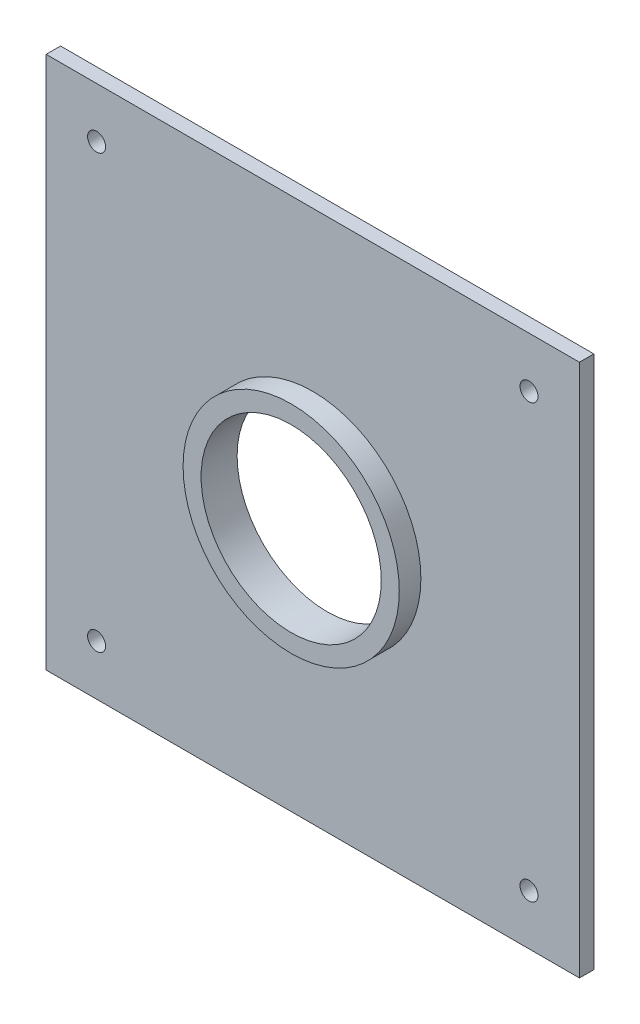
ISO-10303-21;
HEADER;
FILE_DESCRIPTION(('STEP AP214'),'2;1');
FILE_NAME('part.step','',(''),(''),'','','');
FILE_SCHEMA(('AUTOMOTIVE_DESIGN { 1 0 10303 214 1 1 1 1 }'));
ENDSEC;
DATA;
#1=APPLICATION_CONTEXT('core data for automotive mechanical design processes');
#2=APPLICATION_PROTOCOL_DEFINITION('international standard','automotive_design',2000,#1);
#3=PRODUCT_CONTEXT('',#1,'mechanical');
#4=PRODUCT('Part','Part','',(#3));
#5=PRODUCT_RELATED_PRODUCT_CATEGORY('part','',(#4));
#6=PRODUCT_DEFINITION_FORMATION('','',#4);
#7=PRODUCT_DEFINITION_CONTEXT('part definition',#1,'design');
#8=PRODUCT_DEFINITION('design','',#6,#7);
#9=PRODUCT_DEFINITION_SHAPE('','',#8);
#10=(LENGTH_UNIT() NAMED_UNIT(*) SI_UNIT(.MILLI.,.METRE.));
#11=(NAMED_UNIT(*) PLANE_ANGLE_UNIT() SI_UNIT($,.RADIAN.));
#12=(NAMED_UNIT(*) SI_UNIT($,.STERADIAN.) SOLID_ANGLE_UNIT());
#13=UNCERTAINTY_MEASURE_WITH_UNIT(LENGTH_MEASURE(1.E-05),#10,'distance_accuracy_value','');
#14=(GEOMETRIC_REPRESENTATION_CONTEXT(3) GLOBAL_UNCERTAINTY_ASSIGNED_CONTEXT((#13)) GLOBAL_UNIT_ASSIGNED_CONTEXT((#10,
#11,#12)) REPRESENTATION_CONTEXT('',''));
#15=CARTESIAN_POINT('',(0.,0.,0.));
#16=DIRECTION('',(0.,0.,1.));
#17=DIRECTION('',(1.,0.,0.));
#18=AXIS2_PLACEMENT_3D('',#15,#16,#17);
#19=CARTESIAN_POINT('',(0.,0.,0.));
#20=DIRECTION('',(0.,0.,-1.));
#21=DIRECTION('',(-1.,0.,0.));
#22=AXIS2_PLACEMENT_3D('',#19,#20,#21);
#23=PLANE('',#22);
#24=DIRECTION('',(0.,1.,0.));
#25=VECTOR('',#24,1.);
#26=CARTESIAN_POINT('',(0.,0.,0.));
#27=LINE('',#26,#25);
#28=CARTESIAN_POINT('',(0.,-74.,0.));
#29=VERTEX_POINT('',#28);
#30=CARTESIAN_POINT('',(0.,0.,0.));
#31=VERTEX_POINT('',#30);
#32=EDGE_CURVE('E101',#29,#31,#27,.T.);
#33=ORIENTED_EDGE('',*,*,#32,.F.);
#34=DIRECTION('',(1.,0.,0.));
#35=VECTOR('',#34,1.);
#36=CARTESIAN_POINT('',(0.,-74.,0.));
#37=LINE('',#36,#35);
#38=CARTESIAN_POINT('',(-74.,-74.,0.));
#39=VERTEX_POINT('',#38);
#40=EDGE_CURVE('E74',#39,#29,#37,.T.);
#41=ORIENTED_EDGE('',*,*,#40,.F.);
#42=DIRECTION('',(0.,-1.,0.));
#43=VECTOR('',#42,1.);
#44=CARTESIAN_POINT('',(-74.,0.,0.));
#45=LINE('',#44,#43);
#46=CARTESIAN_POINT('',(-74.,0.,0.));
#47=VERTEX_POINT('',#46);
#48=EDGE_CURVE('E68',#47,#39,#45,.T.);
#49=ORIENTED_EDGE('',*,*,#48,.F.);
#50=DIRECTION('',(-1.,0.,0.));
#51=VECTOR('',#50,1.);
#52=CARTESIAN_POINT('',(0.,0.,0.));
#53=LINE('',#52,#51);
#54=EDGE_CURVE('E92',#31,#47,#53,.T.);
#55=ORIENTED_EDGE('',*,*,#54,.F.);
#56=EDGE_LOOP('',(#33,#41,#49,#55));
#57=FACE_BOUND('',#56,.T.);
#58=CARTESIAN_POINT('',(-37.,-37.,0.));
#59=DIRECTION('',(0.,0.,-1.));
#60=DIRECTION('',(-1.,0.,0.));
#61=AXIS2_PLACEMENT_3D('',#58,#59,#60);
#62=CIRCLE('',#61,12.5);
#63=CARTESIAN_POINT('',(-49.5,-37.,0.));
#64=VERTEX_POINT('',#63);
#65=EDGE_CURVE('E118',#64,#64,#62,.T.);
#66=ORIENTED_EDGE('',*,*,#65,.F.);
#67=EDGE_LOOP('',(#66));
#68=FACE_BOUND('',#67,.T.);
#69=CARTESIAN_POINT('',(-7.00000000000001,-67.,0.));
#70=DIRECTION('',(0.,0.,1.));
#71=DIRECTION('',(1.,0.,0.));
#72=AXIS2_PLACEMENT_3D('',#69,#70,#71);
#73=CIRCLE('',#72,1.24999999999999);
#74=CARTESIAN_POINT('',(-5.75000000000002,-67.,0.));
#75=VERTEX_POINT('',#74);
#76=EDGE_CURVE('E122',#75,#75,#73,.T.);
#77=ORIENTED_EDGE('',*,*,#76,.T.);
#78=EDGE_LOOP('',(#77));
#79=FACE_BOUND('',#78,.T.);
#80=CARTESIAN_POINT('',(-67.,-67.,0.));
#81=DIRECTION('',(0.,0.,1.));
#82=DIRECTION('',(1.,0.,0.));
#83=AXIS2_PLACEMENT_3D('',#80,#81,#82);
#84=CIRCLE('',#83,1.24999999999999);
#85=CARTESIAN_POINT('',(-65.75,-67.,0.));
#86=VERTEX_POINT('',#85);
#87=EDGE_CURVE('E126',#86,#86,#84,.T.);
#88=ORIENTED_EDGE('',*,*,#87,.T.);
#89=EDGE_LOOP('',(#88));
#90=FACE_BOUND('',#89,.T.);
#91=CARTESIAN_POINT('',(-7.00000000000001,-7.00000000000003,0.));
#92=DIRECTION('',(0.,0.,1.));
#93=DIRECTION('',(1.,0.,0.));
#94=AXIS2_PLACEMENT_3D('',#91,#92,#93);
#95=CIRCLE('',#94,1.24999999999999);
#96=CARTESIAN_POINT('',(-5.75000000000002,-7.00000000000003,0.));
#97=VERTEX_POINT('',#96);
#98=EDGE_CURVE('E130',#97,#97,#95,.T.);
#99=ORIENTED_EDGE('',*,*,#98,.T.);
#100=EDGE_LOOP('',(#99));
#101=FACE_BOUND('',#100,.T.);
#102=CARTESIAN_POINT('',(-67.,-7.00000000000002,0.));
#103=DIRECTION('',(0.,0.,1.));
#104=DIRECTION('',(1.,0.,0.));
#105=AXIS2_PLACEMENT_3D('',#102,#103,#104);
#106=CIRCLE('',#105,1.24999999999999);
#107=CARTESIAN_POINT('',(-65.75,-7.00000000000002,0.));
#108=VERTEX_POINT('',#107);
#109=EDGE_CURVE('E133',#108,#108,#106,.T.);
#110=ORIENTED_EDGE('',*,*,#109,.T.);
#111=EDGE_LOOP('',(#110));
#112=FACE_BOUND('',#111,.T.);
#113=ADVANCED_FACE('F34',(#57,#68,#79,#90,#101,#112),#23,.T.);
#114=CARTESIAN_POINT('',(0.,0.,2.));
#115=DIRECTION('',(-1.,0.,0.));
#116=DIRECTION('',(0.,0.,1.));
#117=AXIS2_PLACEMENT_3D('',#114,#115,#116);
#118=PLANE('',#117);
#119=ORIENTED_EDGE('',*,*,#32,.T.);
#120=DIRECTION('',(0.,0.,-1.));
#121=VECTOR('',#120,1.);
#122=CARTESIAN_POINT('',(0.,0.,2.));
#123=LINE('',#122,#121);
#124=CARTESIAN_POINT('',(0.,0.,2.));
#125=VERTEX_POINT('',#124);
#126=EDGE_CURVE('E43',#125,#31,#123,.T.);
#127=ORIENTED_EDGE('',*,*,#126,.F.);
#128=DIRECTION('',(0.,1.,0.));
#129=VECTOR('',#128,1.);
#130=CARTESIAN_POINT('',(0.,0.,2.));
#131=LINE('',#130,#129);
#132=CARTESIAN_POINT('',(0.,-74.,2.));
#133=VERTEX_POINT('',#132);
#134=EDGE_CURVE('E87',#133,#125,#131,.T.);
#135=ORIENTED_EDGE('',*,*,#134,.F.);
#136=DIRECTION('',(0.,0.,-1.));
#137=VECTOR('',#136,1.);
#138=CARTESIAN_POINT('',(0.,-74.,2.));
#139=LINE('',#138,#137);
#140=EDGE_CURVE('E97',#133,#29,#139,.T.);
#141=ORIENTED_EDGE('',*,*,#140,.T.);
#142=EDGE_LOOP('',(#119,#127,#135,#141));
#143=FACE_BOUND('',#142,.T.);
#144=ADVANCED_FACE('F36',(#143),#118,.F.);
#145=CARTESIAN_POINT('',(0.,0.,2.));
#146=DIRECTION('',(0.,-1.,0.));
#147=DIRECTION('',(1.,0.,0.));
#148=AXIS2_PLACEMENT_3D('',#145,#146,#147);
#149=PLANE('',#148);
#150=ORIENTED_EDGE('',*,*,#54,.T.);
#151=DIRECTION('',(0.,0.,-1.));
#152=VECTOR('',#151,1.);
#153=CARTESIAN_POINT('',(-74.,0.,2.));
#154=LINE('',#153,#152);
#155=CARTESIAN_POINT('',(-74.,0.,2.));
#156=VERTEX_POINT('',#155);
#157=EDGE_CURVE('E90',#156,#47,#154,.T.);
#158=ORIENTED_EDGE('',*,*,#157,.F.);
#159=DIRECTION('',(-1.,0.,0.));
#160=VECTOR('',#159,1.);
#161=CARTESIAN_POINT('',(0.,0.,2.));
#162=LINE('',#161,#160);
#163=EDGE_CURVE('E82',#125,#156,#162,.T.);
#164=ORIENTED_EDGE('',*,*,#163,.F.);
#165=ORIENTED_EDGE('',*,*,#126,.T.);
#166=EDGE_LOOP('',(#150,#158,#164,#165));
#167=FACE_BOUND('',#166,.T.);
#168=ADVANCED_FACE('F91',(#167),#149,.F.);
#169=CARTESIAN_POINT('',(-74.,0.,2.));
#170=DIRECTION('',(1.,0.,0.));
#171=DIRECTION('',(0.,0.,-1.));
#172=AXIS2_PLACEMENT_3D('',#169,#170,#171);
#173=PLANE('',#172);
#174=ORIENTED_EDGE('',*,*,#48,.T.);
#175=DIRECTION('',(0.,0.,-1.));
#176=VECTOR('',#175,1.);
#177=CARTESIAN_POINT('',(-74.,-74.,2.));
#178=LINE('',#177,#176);
#179=CARTESIAN_POINT('',(-74.,-74.,2.));
#180=VERTEX_POINT('',#179);
#181=EDGE_CURVE('E93',#180,#39,#178,.T.);
#182=ORIENTED_EDGE('',*,*,#181,.F.);
#183=DIRECTION('',(0.,-1.,0.));
#184=VECTOR('',#183,1.);
#185=CARTESIAN_POINT('',(-74.,0.,2.));
#186=LINE('',#185,#184);
#187=EDGE_CURVE('E85',#156,#180,#186,.T.);
#188=ORIENTED_EDGE('',*,*,#187,.F.);
#189=ORIENTED_EDGE('',*,*,#157,.T.);
#190=EDGE_LOOP('',(#174,#182,#188,#189));
#191=FACE_BOUND('',#190,.T.);
#192=ADVANCED_FACE('F95',(#191),#173,.F.);
#193=CARTESIAN_POINT('',(0.,-74.,2.));
#194=DIRECTION('',(0.,1.,0.));
#195=DIRECTION('',(-1.,0.,0.));
#196=AXIS2_PLACEMENT_3D('',#193,#194,#195);
#197=PLANE('',#196);
#198=ORIENTED_EDGE('',*,*,#40,.T.);
#199=ORIENTED_EDGE('',*,*,#140,.F.);
#200=DIRECTION('',(1.,0.,0.));
#201=VECTOR('',#200,1.);
#202=CARTESIAN_POINT('',(0.,-74.,2.));
#203=LINE('',#202,#201);
#204=EDGE_CURVE('E51',#180,#133,#203,.T.);
#205=ORIENTED_EDGE('',*,*,#204,.F.);
#206=ORIENTED_EDGE('',*,*,#181,.T.);
#207=EDGE_LOOP('',(#198,#199,#205,#206));
#208=FACE_BOUND('',#207,.T.);
#209=ADVANCED_FACE('F168',(#208),#197,.F.);
#210=CARTESIAN_POINT('',(0.,0.,2.));
#211=DIRECTION('',(0.,0.,-1.));
#212=DIRECTION('',(-1.,0.,0.));
#213=AXIS2_PLACEMENT_3D('',#210,#211,#212);
#214=PLANE('',#213);
#215=CARTESIAN_POINT('',(-67.,-7.00000000000002,2.));
#216=DIRECTION('',(0.,0.,1.));
#217=DIRECTION('',(1.,0.,0.));
#218=AXIS2_PLACEMENT_3D('',#215,#216,#217);
#219=CIRCLE('',#218,1.24999999999999);
#220=CARTESIAN_POINT('',(-65.75,-7.00000000000002,2.));
#221=VERTEX_POINT('',#220);
#222=EDGE_CURVE('E136',#221,#221,#219,.T.);
#223=ORIENTED_EDGE('',*,*,#222,.F.);
#224=EDGE_LOOP('',(#223));
#225=FACE_BOUND('',#224,.T.);
#226=CARTESIAN_POINT('',(-7.00000000000001,-7.00000000000003,2.));
#227=DIRECTION('',(0.,0.,1.));
#228=DIRECTION('',(1.,0.,0.));
#229=AXIS2_PLACEMENT_3D('',#226,#227,#228);
#230=CIRCLE('',#229,1.24999999999999);
#231=CARTESIAN_POINT('',(-5.75000000000002,-7.00000000000003,2.));
#232=VERTEX_POINT('',#231);
#233=EDGE_CURVE('E135',#232,#232,#230,.T.);
#234=ORIENTED_EDGE('',*,*,#233,.F.);
#235=EDGE_LOOP('',(#234));
#236=FACE_BOUND('',#235,.T.);
#237=CARTESIAN_POINT('',(-67.,-67.,2.));
#238=DIRECTION('',(0.,0.,1.));
#239=DIRECTION('',(1.,0.,0.));
#240=AXIS2_PLACEMENT_3D('',#237,#238,#239);
#241=CIRCLE('',#240,1.24999999999999);
#242=CARTESIAN_POINT('',(-65.75,-67.,2.));
#243=VERTEX_POINT('',#242);
#244=EDGE_CURVE('E144',#243,#243,#241,.T.);
#245=ORIENTED_EDGE('',*,*,#244,.F.);
#246=EDGE_LOOP('',(#245));
#247=FACE_BOUND('',#246,.T.);
#248=CARTESIAN_POINT('',(-7.00000000000001,-67.,2.));
#249=DIRECTION('',(0.,0.,1.));
#250=DIRECTION('',(1.,0.,0.));
#251=AXIS2_PLACEMENT_3D('',#248,#249,#250);
#252=CIRCLE('',#251,1.24999999999999);
#253=CARTESIAN_POINT('',(-5.75000000000002,-67.,2.));
#254=VERTEX_POINT('',#253);
#255=EDGE_CURVE('E148',#254,#254,#252,.T.);
#256=ORIENTED_EDGE('',*,*,#255,.F.);
#257=EDGE_LOOP('',(#256));
#258=FACE_BOUND('',#257,.T.);
#259=CARTESIAN_POINT('',(-37.,-37.,2.));
#260=DIRECTION('',(0.,0.,-1.));
#261=DIRECTION('',(-1.,0.,0.));
#262=AXIS2_PLACEMENT_3D('',#259,#260,#261);
#263=CIRCLE('',#262,15.);
#264=CARTESIAN_POINT('',(-52.,-37.,2.));
#265=VERTEX_POINT('',#264);
#266=EDGE_CURVE('E11',#265,#265,#263,.F.);
#267=ORIENTED_EDGE('',*,*,#266,.F.);
#268=EDGE_LOOP('',(#267));
#269=FACE_BOUND('',#268,.T.);
#270=ORIENTED_EDGE('',*,*,#134,.T.);
#271=ORIENTED_EDGE('',*,*,#163,.T.);
#272=ORIENTED_EDGE('',*,*,#187,.T.);
#273=ORIENTED_EDGE('',*,*,#204,.T.);
#274=EDGE_LOOP('',(#270,#271,#272,#273));
#275=FACE_BOUND('',#274,.T.);
#276=ADVANCED_FACE('F83',(#225,#236,#247,#258,#269,#275),#214,.F.);
#277=CARTESIAN_POINT('',(-37.,-37.,5.));
#278=DIRECTION('',(0.,0.,-1.));
#279=DIRECTION('',(-1.,0.,0.));
#280=AXIS2_PLACEMENT_3D('',#277,#278,#279);
#281=CYLINDRICAL_SURFACE('',#280,15.);
#282=CARTESIAN_POINT('',(-37.,-37.,5.));
#283=DIRECTION('',(0.,0.,1.));
#284=DIRECTION('',(1.,0.,0.));
#285=AXIS2_PLACEMENT_3D('',#282,#283,#284);
#286=CIRCLE('',#285,15.);
#287=CARTESIAN_POINT('',(-22.,-37.,5.));
#288=VERTEX_POINT('',#287);
#289=EDGE_CURVE('E104',#288,#288,#286,.T.);
#290=ORIENTED_EDGE('',*,*,#289,.F.);
#291=EDGE_LOOP('',(#290));
#292=FACE_BOUND('',#291,.T.);
#293=ORIENTED_EDGE('',*,*,#266,.T.);
#294=EDGE_LOOP('',(#293));
#295=FACE_BOUND('',#294,.T.);
#296=ADVANCED_FACE('F161',(#292,#295),#281,.T.);
#297=CARTESIAN_POINT('',(-37.,-37.,5.));
#298=DIRECTION('',(0.,0.,1.));
#299=DIRECTION('',(1.,0.,0.));
#300=AXIS2_PLACEMENT_3D('',#297,#298,#299);
#301=PLANE('',#300);
#302=CARTESIAN_POINT('',(-37.,-37.,5.));
#303=DIRECTION('',(0.,0.,1.));
#304=DIRECTION('',(1.,0.,0.));
#305=AXIS2_PLACEMENT_3D('',#302,#303,#304);
#306=CIRCLE('',#305,12.5);
#307=CARTESIAN_POINT('',(-24.5,-37.,5.));
#308=VERTEX_POINT('',#307);
#309=EDGE_CURVE('E152',#308,#308,#306,.T.);
#310=ORIENTED_EDGE('',*,*,#309,.F.);
#311=EDGE_LOOP('',(#310));
#312=FACE_BOUND('',#311,.T.);
#313=ORIENTED_EDGE('',*,*,#289,.T.);
#314=EDGE_LOOP('',(#313));
#315=FACE_BOUND('',#314,.T.);
#316=ADVANCED_FACE('F159',(#312,#315),#301,.T.);
#317=CARTESIAN_POINT('',(-37.,-37.,-5.));
#318=DIRECTION('',(0.,0.,1.));
#319=DIRECTION('',(1.,0.,0.));
#320=AXIS2_PLACEMENT_3D('',#317,#318,#319);
#321=CYLINDRICAL_SURFACE('',#320,12.5);
#322=ORIENTED_EDGE('',*,*,#65,.T.);
#323=EDGE_LOOP('',(#322));
#324=FACE_BOUND('',#323,.T.);
#325=ORIENTED_EDGE('',*,*,#309,.T.);
#326=EDGE_LOOP('',(#325));
#327=FACE_BOUND('',#326,.T.);
#328=ADVANCED_FACE('F239',(#324,#327),#321,.F.);
#329=CARTESIAN_POINT('',(-7.00000000000001,-67.,2.));
#330=DIRECTION('',(0.,0.,1.));
#331=DIRECTION('',(1.,0.,0.));
#332=AXIS2_PLACEMENT_3D('',#329,#330,#331);
#333=CYLINDRICAL_SURFACE('',#332,1.24999999999999);
#334=ORIENTED_EDGE('',*,*,#76,.F.);
#335=EDGE_LOOP('',(#334));
#336=FACE_BOUND('',#335,.T.);
#337=ORIENTED_EDGE('',*,*,#255,.T.);
#338=EDGE_LOOP('',(#337));
#339=FACE_BOUND('',#338,.T.);
#340=ADVANCED_FACE('F232',(#336,#339),#333,.F.);
#341=CARTESIAN_POINT('',(-67.,-67.,2.));
#342=DIRECTION('',(0.,0.,1.));
#343=DIRECTION('',(1.,0.,0.));
#344=AXIS2_PLACEMENT_3D('',#341,#342,#343);
#345=CYLINDRICAL_SURFACE('',#344,1.24999999999999);
#346=ORIENTED_EDGE('',*,*,#87,.F.);
#347=EDGE_LOOP('',(#346));
#348=FACE_BOUND('',#347,.T.);
#349=ORIENTED_EDGE('',*,*,#244,.T.);
#350=EDGE_LOOP('',(#349));
#351=FACE_BOUND('',#350,.T.);
#352=ADVANCED_FACE('F197',(#348,#351),#345,.F.);
#353=CARTESIAN_POINT('',(-7.00000000000001,-7.00000000000003,2.));
#354=DIRECTION('',(0.,0.,1.));
#355=DIRECTION('',(1.,0.,0.));
#356=AXIS2_PLACEMENT_3D('',#353,#354,#355);
#357=CYLINDRICAL_SURFACE('',#356,1.24999999999999);
#358=ORIENTED_EDGE('',*,*,#98,.F.);
#359=EDGE_LOOP('',(#358));
#360=FACE_BOUND('',#359,.T.);
#361=ORIENTED_EDGE('',*,*,#233,.T.);
#362=EDGE_LOOP('',(#361));
#363=FACE_BOUND('',#362,.T.);
#364=ADVANCED_FACE('F208',(#360,#363),#357,.F.);
#365=CARTESIAN_POINT('',(-67.,-7.00000000000002,2.));
#366=DIRECTION('',(0.,0.,1.));
#367=DIRECTION('',(1.,0.,0.));
#368=AXIS2_PLACEMENT_3D('',#365,#366,#367);
#369=CYLINDRICAL_SURFACE('',#368,1.24999999999999);
#370=ORIENTED_EDGE('',*,*,#109,.F.);
#371=EDGE_LOOP('',(#370));
#372=FACE_BOUND('',#371,.T.);
#373=ORIENTED_EDGE('',*,*,#222,.T.);
#374=EDGE_LOOP('',(#373));
#375=FACE_BOUND('',#374,.T.);
#376=ADVANCED_FACE('F213',(#372,#375),#369,.F.);
#377=CLOSED_SHELL('',(#113,#144,#168,#192,#209,#276,#296,#316,#328,#340,#352,#364,#376));
#378=MANIFOLD_SOLID_BREP('B2',#377);
#379=ADVANCED_BREP_SHAPE_REPRESENTATION('',(#18,#378),#14);
#380=SHAPE_DEFINITION_REPRESENTATION(#9,#379);
ENDSEC;
END-ISO-10303-21;
